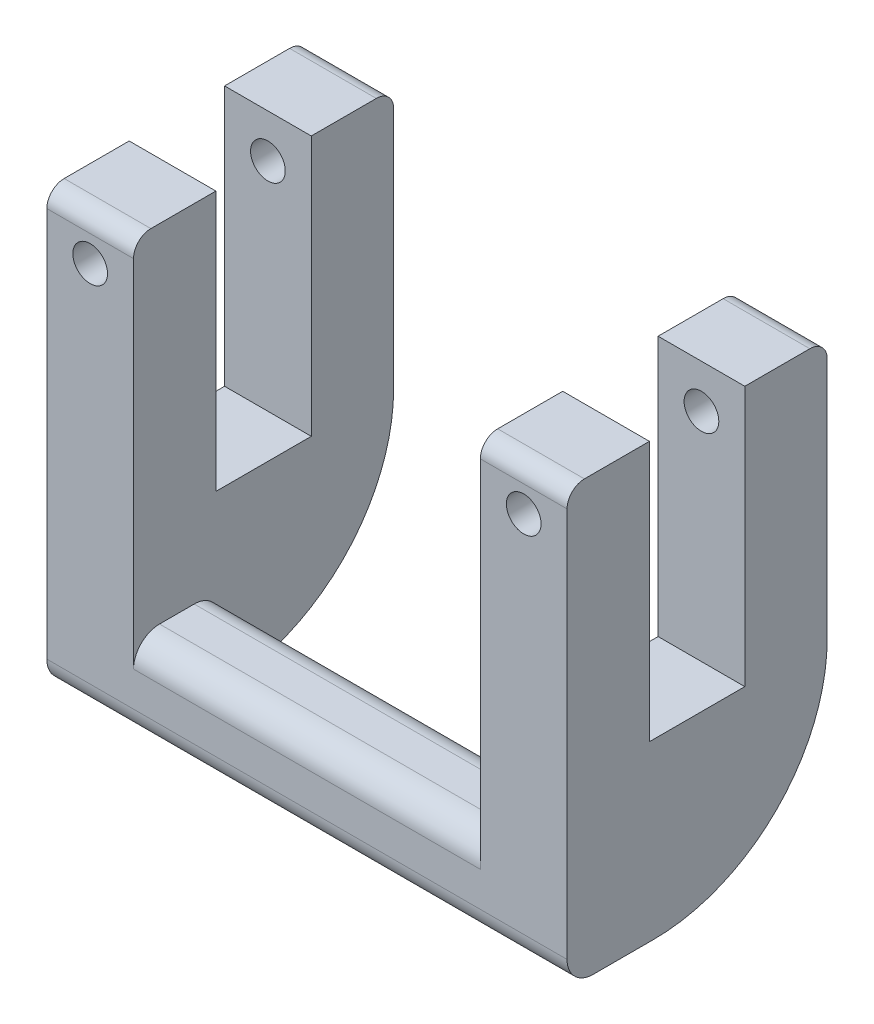
ISO-10303-21;
HEADER;
FILE_DESCRIPTION(('STEP AP214'),'2;1');
FILE_NAME('part.step','',(''),(''),'','','');
FILE_SCHEMA(('AUTOMOTIVE_DESIGN { 1 0 10303 214 1 1 1 1 }'));
ENDSEC;
DATA;
#1=APPLICATION_CONTEXT('core data for automotive mechanical design processes');
#2=APPLICATION_PROTOCOL_DEFINITION('international standard','automotive_design',2000,#1);
#3=PRODUCT_CONTEXT('',#1,'mechanical');
#4=PRODUCT('Part','Part','',(#3));
#5=PRODUCT_RELATED_PRODUCT_CATEGORY('part','',(#4));
#6=PRODUCT_DEFINITION_FORMATION('','',#4);
#7=PRODUCT_DEFINITION_CONTEXT('part definition',#1,'design');
#8=PRODUCT_DEFINITION('design','',#6,#7);
#9=PRODUCT_DEFINITION_SHAPE('','',#8);
#10=(LENGTH_UNIT() NAMED_UNIT(*) SI_UNIT(.MILLI.,.METRE.));
#11=(NAMED_UNIT(*) PLANE_ANGLE_UNIT() SI_UNIT($,.RADIAN.));
#12=(NAMED_UNIT(*) SI_UNIT($,.STERADIAN.) SOLID_ANGLE_UNIT());
#13=UNCERTAINTY_MEASURE_WITH_UNIT(LENGTH_MEASURE(1.E-05),#10,'distance_accuracy_value','');
#14=(GEOMETRIC_REPRESENTATION_CONTEXT(3) GLOBAL_UNCERTAINTY_ASSIGNED_CONTEXT((#13)) GLOBAL_UNIT_ASSIGNED_CONTEXT((#10,
#11,#12)) REPRESENTATION_CONTEXT('',''));
#15=CARTESIAN_POINT('',(0.,0.,0.));
#16=DIRECTION('',(0.,0.,1.));
#17=DIRECTION('',(1.,0.,0.));
#18=AXIS2_PLACEMENT_3D('',#15,#16,#17);
#19=CARTESIAN_POINT('',(0.,0.,30.));
#20=DIRECTION('',(0.,-1.,0.));
#21=DIRECTION('',(0.,0.,-1.));
#22=AXIS2_PLACEMENT_3D('',#19,#20,#21);
#23=PLANE('',#22);
#24=DIRECTION('',(0.,0.,-1.));
#25=VECTOR('',#24,1.);
#26=CARTESIAN_POINT('',(-40.,0.,30.));
#27=LINE('',#26,#25);
#28=CARTESIAN_POINT('',(-40.,0.,27.));
#29=VERTEX_POINT('',#28);
#30=CARTESIAN_POINT('',(-40.,0.,23.));
#31=VERTEX_POINT('',#30);
#32=EDGE_CURVE('E355',#29,#31,#27,.T.);
#33=ORIENTED_EDGE('',*,*,#32,.F.);
#34=DIRECTION('',(-1.,0.,0.));
#35=VECTOR('',#34,1.);
#36=CARTESIAN_POINT('',(0.,0.,27.));
#37=LINE('',#36,#35);
#38=CARTESIAN_POINT('',(0.,0.,27.));
#39=VERTEX_POINT('',#38);
#40=EDGE_CURVE('E400',#29,#39,#37,.F.);
#41=ORIENTED_EDGE('',*,*,#40,.T.);
#42=DIRECTION('',(0.,0.,-1.));
#43=VECTOR('',#42,1.);
#44=CARTESIAN_POINT('',(0.,0.,30.));
#45=LINE('',#44,#43);
#46=CARTESIAN_POINT('',(0.,0.,23.));
#47=VERTEX_POINT('',#46);
#48=EDGE_CURVE('E359',#39,#47,#45,.T.);
#49=ORIENTED_EDGE('',*,*,#48,.T.);
#50=DIRECTION('',(1.,0.,0.));
#51=VECTOR('',#50,1.);
#52=CARTESIAN_POINT('',(-40.,0.,23.));
#53=LINE('',#52,#51);
#54=EDGE_CURVE('E397',#47,#31,#53,.F.);
#55=ORIENTED_EDGE('',*,*,#54,.T.);
#56=EDGE_LOOP('',(#33,#41,#49,#55));
#57=FACE_BOUND('',#56,.T.);
#58=ADVANCED_FACE('F39',(#57),#23,.F.);
#59=CARTESIAN_POINT('',(0.,0.,0.));
#60=DIRECTION('',(0.,0.,-1.));
#61=DIRECTION('',(-1.,0.,0.));
#62=AXIS2_PLACEMENT_3D('',#59,#60,#61);
#63=PLANE('',#62);
#64=CARTESIAN_POINT('',(5.,35.,0.));
#65=DIRECTION('',(0.,0.,-1.));
#66=DIRECTION('',(-1.,0.,0.));
#67=AXIS2_PLACEMENT_3D('',#64,#65,#66);
#68=CIRCLE('',#67,2.);
#69=CARTESIAN_POINT('',(3.,35.,0.));
#70=VERTEX_POINT('',#69);
#71=EDGE_CURVE('E624',#70,#70,#68,.T.);
#72=ORIENTED_EDGE('',*,*,#71,.F.);
#73=EDGE_LOOP('',(#72));
#74=FACE_BOUND('',#73,.T.);
#75=DIRECTION('',(0.,-1.,0.));
#76=VECTOR('',#75,1.);
#77=CARTESIAN_POINT('',(0.,40.,0.));
#78=LINE('',#77,#76);
#79=CARTESIAN_POINT('',(0.,38.,0.));
#80=VERTEX_POINT('',#79);
#81=CARTESIAN_POINT('',(0.,9.99999999999999,0.));
#82=VERTEX_POINT('',#81);
#83=EDGE_CURVE('E305',#80,#82,#78,.T.);
#84=ORIENTED_EDGE('',*,*,#83,.F.);
#85=DIRECTION('',(-1.,0.,0.));
#86=VECTOR('',#85,1.);
#87=CARTESIAN_POINT('',(10.,38.,0.));
#88=LINE('',#87,#86);
#89=CARTESIAN_POINT('',(10.,38.,0.));
#90=VERTEX_POINT('',#89);
#91=EDGE_CURVE('E11',#80,#90,#88,.F.);
#92=ORIENTED_EDGE('',*,*,#91,.T.);
#93=DIRECTION('',(0.,1.,0.));
#94=VECTOR('',#93,1.);
#95=CARTESIAN_POINT('',(10.,-10.,0.));
#96=LINE('',#95,#94);
#97=CARTESIAN_POINT('',(10.,9.99999999999999,0.));
#98=VERTEX_POINT('',#97);
#99=EDGE_CURVE('E310',#98,#90,#96,.T.);
#100=ORIENTED_EDGE('',*,*,#99,.F.);
#101=DIRECTION('',(1.,0.,0.));
#102=VECTOR('',#101,1.);
#103=CARTESIAN_POINT('',(0.,9.99999999999999,0.));
#104=LINE('',#103,#102);
#105=EDGE_CURVE('E452',#98,#82,#104,.F.);
#106=ORIENTED_EDGE('',*,*,#105,.T.);
#107=EDGE_LOOP('',(#84,#92,#100,#106));
#108=FACE_BOUND('',#107,.T.);
#109=ADVANCED_FACE('F607',(#74,#108),#63,.T.);
#110=CARTESIAN_POINT('',(-40.,40.,30.));
#111=DIRECTION('',(0.,-1.,0.));
#112=DIRECTION('',(1.,0.,0.));
#113=AXIS2_PLACEMENT_3D('',#110,#111,#112);
#114=PLANE('',#113);
#115=DIRECTION('',(0.,0.,-1.));
#116=VECTOR('',#115,1.);
#117=CARTESIAN_POINT('',(-50.,40.,30.));
#118=LINE('',#117,#116);
#119=CARTESIAN_POINT('',(-50.,40.,28.));
#120=VERTEX_POINT('',#119);
#121=CARTESIAN_POINT('',(-50.,40.,20.5));
#122=VERTEX_POINT('',#121);
#123=EDGE_CURVE('E255',#120,#122,#118,.T.);
#124=ORIENTED_EDGE('',*,*,#123,.F.);
#125=DIRECTION('',(-1.,0.,0.));
#126=VECTOR('',#125,1.);
#127=CARTESIAN_POINT('',(-40.,40.,28.));
#128=LINE('',#127,#126);
#129=CARTESIAN_POINT('',(-40.,40.,28.));
#130=VERTEX_POINT('',#129);
#131=EDGE_CURVE('E498',#120,#130,#128,.F.);
#132=ORIENTED_EDGE('',*,*,#131,.T.);
#133=DIRECTION('',(0.,0.,-1.));
#134=VECTOR('',#133,1.);
#135=CARTESIAN_POINT('',(-40.,40.,30.));
#136=LINE('',#135,#134);
#137=CARTESIAN_POINT('',(-40.,40.,20.5));
#138=VERTEX_POINT('',#137);
#139=EDGE_CURVE('E352',#130,#138,#136,.T.);
#140=ORIENTED_EDGE('',*,*,#139,.T.);
#141=DIRECTION('',(-1.,0.,0.));
#142=VECTOR('',#141,1.);
#143=CARTESIAN_POINT('',(-40.,40.,20.5));
#144=LINE('',#143,#142);
#145=EDGE_CURVE('E293',#138,#122,#144,.T.);
#146=ORIENTED_EDGE('',*,*,#145,.T.);
#147=EDGE_LOOP('',(#124,#132,#140,#146));
#148=FACE_BOUND('',#147,.T.);
#149=ADVANCED_FACE('F569',(#148),#114,.F.);
#150=CARTESIAN_POINT('',(10.,40.,30.));
#151=DIRECTION('',(0.,-1.,0.));
#152=DIRECTION('',(0.,0.,-1.));
#153=AXIS2_PLACEMENT_3D('',#150,#151,#152);
#154=PLANE('',#153);
#155=DIRECTION('',(0.,0.,-1.));
#156=VECTOR('',#155,1.);
#157=CARTESIAN_POINT('',(0.,40.,30.));
#158=LINE('',#157,#156);
#159=CARTESIAN_POINT('',(0.,40.,28.));
#160=VERTEX_POINT('',#159);
#161=CARTESIAN_POINT('',(0.,40.,20.5));
#162=VERTEX_POINT('',#161);
#163=EDGE_CURVE('E333',#160,#162,#158,.T.);
#164=ORIENTED_EDGE('',*,*,#163,.F.);
#165=DIRECTION('',(-1.,0.,0.));
#166=VECTOR('',#165,1.);
#167=CARTESIAN_POINT('',(10.,40.,28.));
#168=LINE('',#167,#166);
#169=CARTESIAN_POINT('',(10.,40.,28.));
#170=VERTEX_POINT('',#169);
#171=EDGE_CURVE('E507',#160,#170,#168,.F.);
#172=ORIENTED_EDGE('',*,*,#171,.T.);
#173=DIRECTION('',(0.,0.,-1.));
#174=VECTOR('',#173,1.);
#175=CARTESIAN_POINT('',(10.,40.,30.));
#176=LINE('',#175,#174);
#177=CARTESIAN_POINT('',(10.,40.,20.5));
#178=VERTEX_POINT('',#177);
#179=EDGE_CURVE('E337',#170,#178,#176,.T.);
#180=ORIENTED_EDGE('',*,*,#179,.T.);
#181=DIRECTION('',(-1.,0.,0.));
#182=VECTOR('',#181,1.);
#183=CARTESIAN_POINT('',(10.,40.,20.5));
#184=LINE('',#183,#182);
#185=EDGE_CURVE('E367',#178,#162,#184,.T.);
#186=ORIENTED_EDGE('',*,*,#185,.T.);
#187=EDGE_LOOP('',(#164,#172,#180,#186));
#188=FACE_BOUND('',#187,.T.);
#189=ADVANCED_FACE('F545',(#188),#154,.F.);
#190=CARTESIAN_POINT('',(0.,40.,30.));
#191=DIRECTION('',(1.,0.,0.));
#192=DIRECTION('',(0.,1.,0.));
#193=AXIS2_PLACEMENT_3D('',#190,#191,#192);
#194=PLANE('',#193);
#195=DIRECTION('',(0.,-1.,0.));
#196=VECTOR('',#195,1.);
#197=CARTESIAN_POINT('',(0.,40.,30.));
#198=LINE('',#197,#196);
#199=CARTESIAN_POINT('',(0.,38.,30.));
#200=VERTEX_POINT('',#199);
#201=CARTESIAN_POINT('',(0.,-3.,30.));
#202=VERTEX_POINT('',#201);
#203=EDGE_CURVE('E306',#200,#202,#198,.T.);
#204=ORIENTED_EDGE('',*,*,#203,.F.);
#205=CARTESIAN_POINT('',(0.,38.,28.));
#206=DIRECTION('',(1.,0.,0.));
#207=DIRECTION('',(0.,1.,0.));
#208=AXIS2_PLACEMENT_3D('',#205,#206,#207);
#209=CIRCLE('',#208,2.);
#210=EDGE_CURVE('E504',#200,#160,#209,.F.);
#211=ORIENTED_EDGE('',*,*,#210,.T.);
#212=ORIENTED_EDGE('',*,*,#163,.T.);
#213=DIRECTION('',(0.,-1.,0.));
#214=VECTOR('',#213,1.);
#215=CARTESIAN_POINT('',(0.,40.,20.5));
#216=LINE('',#215,#214);
#217=CARTESIAN_POINT('',(0.,10.,20.5));
#218=VERTEX_POINT('',#217);
#219=EDGE_CURVE('E289',#162,#218,#216,.T.);
#220=ORIENTED_EDGE('',*,*,#219,.T.);
#221=DIRECTION('',(0.,0.,-1.));
#222=VECTOR('',#221,1.);
#223=CARTESIAN_POINT('',(0.,9.99999999999999,30.));
#224=LINE('',#223,#222);
#225=CARTESIAN_POINT('',(0.,10.,9.49999999999999));
#226=VERTEX_POINT('',#225);
#227=EDGE_CURVE('E301',#218,#226,#224,.T.);
#228=ORIENTED_EDGE('',*,*,#227,.T.);
#229=DIRECTION('',(0.,1.,0.));
#230=VECTOR('',#229,1.);
#231=CARTESIAN_POINT('',(0.,40.,9.5));
#232=LINE('',#231,#230);
#233=CARTESIAN_POINT('',(0.,40.,9.5));
#234=VERTEX_POINT('',#233);
#235=EDGE_CURVE('E273',#226,#234,#232,.T.);
#236=ORIENTED_EDGE('',*,*,#235,.T.);
#237=CARTESIAN_POINT('',(0.,40.,2.));
#238=VERTEX_POINT('',#237);
#239=EDGE_CURVE('E321',#234,#238,#158,.T.);
#240=ORIENTED_EDGE('',*,*,#239,.T.);
#241=CARTESIAN_POINT('',(0.,38.,2.));
#242=DIRECTION('',(1.,0.,0.));
#243=DIRECTION('',(0.,1.,0.));
#244=AXIS2_PLACEMENT_3D('',#241,#242,#243);
#245=CIRCLE('',#244,2.);
#246=EDGE_CURVE('E501',#238,#80,#245,.F.);
#247=ORIENTED_EDGE('',*,*,#246,.T.);
#248=ORIENTED_EDGE('',*,*,#83,.T.);
#249=CARTESIAN_POINT('',(0.,9.99999999999999,20.));
#250=DIRECTION('',(1.,0.,0.));
#251=DIRECTION('',(0.,1.,0.));
#252=AXIS2_PLACEMENT_3D('',#249,#250,#251);
#253=CIRCLE('',#252,20.);
#254=CARTESIAN_POINT('',(0.,-10.,20.));
#255=VERTEX_POINT('',#254);
#256=EDGE_CURVE('E456',#82,#255,#253,.F.);
#257=ORIENTED_EDGE('',*,*,#256,.T.);
#258=DIRECTION('',(0.,0.,-1.));
#259=VECTOR('',#258,1.);
#260=CARTESIAN_POINT('',(0.,-10.,20.));
#261=LINE('',#260,#259);
#262=CARTESIAN_POINT('',(0.,-10.,23.));
#263=VERTEX_POINT('',#262);
#264=EDGE_CURVE('E261',#263,#255,#261,.T.);
#265=ORIENTED_EDGE('',*,*,#264,.F.);
#266=CARTESIAN_POINT('',(0.,-7.,23.));
#267=DIRECTION('',(1.,0.,0.));
#268=DIRECTION('',(0.,1.,0.));
#269=AXIS2_PLACEMENT_3D('',#266,#267,#268);
#270=CIRCLE('',#269,3.);
#271=CARTESIAN_POINT('',(0.,-7.,20.));
#272=VERTEX_POINT('',#271);
#273=EDGE_CURVE('E422',#263,#272,#270,.T.);
#274=ORIENTED_EDGE('',*,*,#273,.T.);
#275=DIRECTION('',(0.,-1.,0.));
#276=VECTOR('',#275,1.);
#277=CARTESIAN_POINT('',(0.,0.,20.));
#278=LINE('',#277,#276);
#279=CARTESIAN_POINT('',(0.,-3.,20.));
#280=VERTEX_POINT('',#279);
#281=EDGE_CURVE('E617',#280,#272,#278,.T.);
#282=ORIENTED_EDGE('',*,*,#281,.F.);
#283=CARTESIAN_POINT('',(0.,-3.,23.));
#284=DIRECTION('',(1.,0.,0.));
#285=DIRECTION('',(0.,1.,0.));
#286=AXIS2_PLACEMENT_3D('',#283,#284,#285);
#287=CIRCLE('',#286,3.);
#288=EDGE_CURVE('E425',#280,#47,#287,.T.);
#289=ORIENTED_EDGE('',*,*,#288,.T.);
#290=ORIENTED_EDGE('',*,*,#48,.F.);
#291=CARTESIAN_POINT('',(0.,-3.,27.));
#292=DIRECTION('',(1.,0.,0.));
#293=DIRECTION('',(0.,1.,0.));
#294=AXIS2_PLACEMENT_3D('',#291,#292,#293);
#295=CIRCLE('',#294,3.);
#296=EDGE_CURVE('E414',#39,#202,#295,.T.);
#297=ORIENTED_EDGE('',*,*,#296,.T.);
#298=EDGE_LOOP('',(#204,#211,#212,#220,#228,#236,#240,#247,#248,#257,#265,#274,#282,#289,#290,#297));
#299=FACE_BOUND('',#298,.T.);
#300=ADVANCED_FACE('F524',(#299),#194,.F.);
#301=CARTESIAN_POINT('',(-40.,0.,30.));
#302=DIRECTION('',(-1.,0.,0.));
#303=DIRECTION('',(0.,0.,1.));
#304=AXIS2_PLACEMENT_3D('',#301,#302,#303);
#305=PLANE('',#304);
#306=DIRECTION('',(0.,1.,0.));
#307=VECTOR('',#306,1.);
#308=CARTESIAN_POINT('',(-40.,0.,0.));
#309=LINE('',#308,#307);
#310=CARTESIAN_POINT('',(-40.,9.99999999999999,0.));
#311=VERTEX_POINT('',#310);
#312=CARTESIAN_POINT('',(-40.,38.,0.));
#313=VERTEX_POINT('',#312);
#314=EDGE_CURVE('E324',#311,#313,#309,.T.);
#315=ORIENTED_EDGE('',*,*,#314,.T.);
#316=CARTESIAN_POINT('',(-40.,38.,2.));
#317=DIRECTION('',(-1.,0.,0.));
#318=DIRECTION('',(0.,0.,1.));
#319=AXIS2_PLACEMENT_3D('',#316,#317,#318);
#320=CIRCLE('',#319,2.);
#321=CARTESIAN_POINT('',(-40.,40.,2.));
#322=VERTEX_POINT('',#321);
#323=EDGE_CURVE('E487',#313,#322,#320,.F.);
#324=ORIENTED_EDGE('',*,*,#323,.T.);
#325=CARTESIAN_POINT('',(-40.,40.,9.5));
#326=VERTEX_POINT('',#325);
#327=EDGE_CURVE('E351',#326,#322,#136,.T.);
#328=ORIENTED_EDGE('',*,*,#327,.F.);
#329=DIRECTION('',(0.,-1.,0.));
#330=VECTOR('',#329,1.);
#331=CARTESIAN_POINT('',(-40.,0.,9.49999999999999));
#332=LINE('',#331,#330);
#333=CARTESIAN_POINT('',(-40.,10.,9.49999999999999));
#334=VERTEX_POINT('',#333);
#335=EDGE_CURVE('E281',#326,#334,#332,.T.);
#336=ORIENTED_EDGE('',*,*,#335,.T.);
#337=DIRECTION('',(0.,0.,1.));
#338=VECTOR('',#337,1.);
#339=CARTESIAN_POINT('',(-40.,9.99999999999999,30.));
#340=LINE('',#339,#338);
#341=CARTESIAN_POINT('',(-40.,9.99999999999999,20.5));
#342=VERTEX_POINT('',#341);
#343=EDGE_CURVE('E298',#334,#342,#340,.T.);
#344=ORIENTED_EDGE('',*,*,#343,.T.);
#345=DIRECTION('',(0.,1.,0.));
#346=VECTOR('',#345,1.);
#347=CARTESIAN_POINT('',(-40.,0.,20.5));
#348=LINE('',#347,#346);
#349=EDGE_CURVE('E234',#342,#138,#348,.T.);
#350=ORIENTED_EDGE('',*,*,#349,.T.);
#351=ORIENTED_EDGE('',*,*,#139,.F.);
#352=CARTESIAN_POINT('',(-40.,38.,28.));
#353=DIRECTION('',(-1.,0.,0.));
#354=DIRECTION('',(0.,0.,1.));
#355=AXIS2_PLACEMENT_3D('',#352,#353,#354);
#356=CIRCLE('',#355,2.);
#357=CARTESIAN_POINT('',(-40.,38.,30.));
#358=VERTEX_POINT('',#357);
#359=EDGE_CURVE('E484',#130,#358,#356,.F.);
#360=ORIENTED_EDGE('',*,*,#359,.T.);
#361=DIRECTION('',(0.,1.,0.));
#362=VECTOR('',#361,1.);
#363=CARTESIAN_POINT('',(-40.,0.,30.));
#364=LINE('',#363,#362);
#365=CARTESIAN_POINT('',(-40.,-3.,30.));
#366=VERTEX_POINT('',#365);
#367=EDGE_CURVE('E309',#366,#358,#364,.T.);
#368=ORIENTED_EDGE('',*,*,#367,.F.);
#369=CARTESIAN_POINT('',(-40.,-3.,27.));
#370=DIRECTION('',(-1.,0.,0.));
#371=DIRECTION('',(0.,0.,1.));
#372=AXIS2_PLACEMENT_3D('',#369,#370,#371);
#373=CIRCLE('',#372,3.);
#374=EDGE_CURVE('E411',#366,#29,#373,.T.);
#375=ORIENTED_EDGE('',*,*,#374,.T.);
#376=ORIENTED_EDGE('',*,*,#32,.T.);
#377=CARTESIAN_POINT('',(-40.,-3.,23.));
#378=DIRECTION('',(-1.,0.,0.));
#379=DIRECTION('',(0.,0.,1.));
#380=AXIS2_PLACEMENT_3D('',#377,#378,#379);
#381=CIRCLE('',#380,3.);
#382=CARTESIAN_POINT('',(-40.,-3.,20.));
#383=VERTEX_POINT('',#382);
#384=EDGE_CURVE('E428',#31,#383,#381,.T.);
#385=ORIENTED_EDGE('',*,*,#384,.T.);
#386=DIRECTION('',(0.,1.,0.));
#387=VECTOR('',#386,1.);
#388=CARTESIAN_POINT('',(-40.,0.,20.));
#389=LINE('',#388,#387);
#390=CARTESIAN_POINT('',(-40.,-7.,20.));
#391=VERTEX_POINT('',#390);
#392=EDGE_CURVE('E614',#391,#383,#389,.T.);
#393=ORIENTED_EDGE('',*,*,#392,.F.);
#394=CARTESIAN_POINT('',(-40.,-7.,23.));
#395=DIRECTION('',(-1.,0.,0.));
#396=DIRECTION('',(0.,0.,1.));
#397=AXIS2_PLACEMENT_3D('',#394,#395,#396);
#398=CIRCLE('',#397,3.);
#399=CARTESIAN_POINT('',(-40.,-10.,23.));
#400=VERTEX_POINT('',#399);
#401=EDGE_CURVE('E418',#391,#400,#398,.T.);
#402=ORIENTED_EDGE('',*,*,#401,.T.);
#403=DIRECTION('',(0.,0.,-1.));
#404=VECTOR('',#403,1.);
#405=CARTESIAN_POINT('',(-40.,-10.,20.));
#406=LINE('',#405,#404);
#407=CARTESIAN_POINT('',(-40.,-10.,20.));
#408=VERTEX_POINT('',#407);
#409=EDGE_CURVE('E257',#400,#408,#406,.T.);
#410=ORIENTED_EDGE('',*,*,#409,.T.);
#411=CARTESIAN_POINT('',(-40.,9.99999999999999,20.));
#412=DIRECTION('',(-1.,0.,0.));
#413=DIRECTION('',(0.,0.,1.));
#414=AXIS2_PLACEMENT_3D('',#411,#412,#413);
#415=CIRCLE('',#414,20.);
#416=EDGE_CURVE('E439',#408,#311,#415,.F.);
#417=ORIENTED_EDGE('',*,*,#416,.T.);
#418=EDGE_LOOP('',(#315,#324,#328,#336,#344,#350,#351,#360,#368,#375,#376,#385,#393,#402,#410,#417));
#419=FACE_BOUND('',#418,.T.);
#420=ADVANCED_FACE('F571',(#419),#305,.F.);
#421=ORIENTED_EDGE('',*,*,#327,.T.);
#422=DIRECTION('',(-1.,0.,0.));
#423=VECTOR('',#422,1.);
#424=CARTESIAN_POINT('',(-50.,40.,2.));
#425=LINE('',#424,#423);
#426=CARTESIAN_POINT('',(-50.,40.,2.));
#427=VERTEX_POINT('',#426);
#428=EDGE_CURVE('E459',#322,#427,#425,.T.);
#429=ORIENTED_EDGE('',*,*,#428,.T.);
#430=CARTESIAN_POINT('',(-50.,40.,9.5));
#431=VERTEX_POINT('',#430);
#432=EDGE_CURVE('E348',#431,#427,#118,.T.);
#433=ORIENTED_EDGE('',*,*,#432,.F.);
#434=DIRECTION('',(1.,0.,0.));
#435=VECTOR('',#434,1.);
#436=CARTESIAN_POINT('',(-40.,40.,9.5));
#437=LINE('',#436,#435);
#438=EDGE_CURVE('E277',#431,#326,#437,.T.);
#439=ORIENTED_EDGE('',*,*,#438,.T.);
#440=EDGE_LOOP('',(#421,#429,#433,#439));
#441=FACE_BOUND('',#440,.T.);
#442=ADVANCED_FACE('F578',(#441),#114,.F.);
#443=CARTESIAN_POINT('',(-50.,40.,30.));
#444=DIRECTION('',(1.,0.,0.));
#445=DIRECTION('',(0.,1.,0.));
#446=AXIS2_PLACEMENT_3D('',#443,#444,#445);
#447=PLANE('',#446);
#448=ORIENTED_EDGE('',*,*,#432,.T.);
#449=CARTESIAN_POINT('',(-50.,38.,2.));
#450=DIRECTION('',(1.,0.,0.));
#451=DIRECTION('',(0.,1.,0.));
#452=AXIS2_PLACEMENT_3D('',#449,#450,#451);
#453=CIRCLE('',#452,2.);
#454=CARTESIAN_POINT('',(-50.,38.,0.));
#455=VERTEX_POINT('',#454);
#456=EDGE_CURVE('E478',#427,#455,#453,.F.);
#457=ORIENTED_EDGE('',*,*,#456,.T.);
#458=DIRECTION('',(0.,-1.,0.));
#459=VECTOR('',#458,1.);
#460=CARTESIAN_POINT('',(-50.,40.,0.));
#461=LINE('',#460,#459);
#462=CARTESIAN_POINT('',(-50.,9.99999999999999,0.));
#463=VERTEX_POINT('',#462);
#464=EDGE_CURVE('E328',#455,#463,#461,.T.);
#465=ORIENTED_EDGE('',*,*,#464,.T.);
#466=CARTESIAN_POINT('',(-50.,9.99999999999999,20.));
#467=DIRECTION('',(1.,0.,0.));
#468=DIRECTION('',(0.,1.,0.));
#469=AXIS2_PLACEMENT_3D('',#466,#467,#468);
#470=CIRCLE('',#469,20.);
#471=CARTESIAN_POINT('',(-50.,-10.,20.));
#472=VERTEX_POINT('',#471);
#473=EDGE_CURVE('E446',#463,#472,#470,.F.);
#474=ORIENTED_EDGE('',*,*,#473,.T.);
#475=DIRECTION('',(0.,0.,-1.));
#476=VECTOR('',#475,1.);
#477=CARTESIAN_POINT('',(-50.,-10.,30.));
#478=LINE('',#477,#476);
#479=CARTESIAN_POINT('',(-50.,-10.,27.));
#480=VERTEX_POINT('',#479);
#481=EDGE_CURVE('E344',#480,#472,#478,.T.);
#482=ORIENTED_EDGE('',*,*,#481,.F.);
#483=CARTESIAN_POINT('',(-50.,-7.,27.));
#484=DIRECTION('',(1.,0.,0.));
#485=DIRECTION('',(0.,1.,0.));
#486=AXIS2_PLACEMENT_3D('',#483,#484,#485);
#487=CIRCLE('',#486,3.);
#488=CARTESIAN_POINT('',(-50.,-7.,30.));
#489=VERTEX_POINT('',#488);
#490=EDGE_CURVE('E393',#480,#489,#487,.F.);
#491=ORIENTED_EDGE('',*,*,#490,.T.);
#492=DIRECTION('',(0.,-1.,0.));
#493=VECTOR('',#492,1.);
#494=CARTESIAN_POINT('',(-50.,40.,30.));
#495=LINE('',#494,#493);
#496=CARTESIAN_POINT('',(-50.,38.,30.));
#497=VERTEX_POINT('',#496);
#498=EDGE_CURVE('E314',#497,#489,#495,.T.);
#499=ORIENTED_EDGE('',*,*,#498,.F.);
#500=CARTESIAN_POINT('',(-50.,38.,28.));
#501=DIRECTION('',(1.,0.,0.));
#502=DIRECTION('',(0.,1.,0.));
#503=AXIS2_PLACEMENT_3D('',#500,#501,#502);
#504=CIRCLE('',#503,2.);
#505=EDGE_CURVE('E475',#497,#120,#504,.F.);
#506=ORIENTED_EDGE('',*,*,#505,.T.);
#507=ORIENTED_EDGE('',*,*,#123,.T.);
#508=DIRECTION('',(0.,-1.,0.));
#509=VECTOR('',#508,1.);
#510=CARTESIAN_POINT('',(-50.,70.,20.5));
#511=LINE('',#510,#509);
#512=CARTESIAN_POINT('',(-50.,9.99999999999999,20.5));
#513=VERTEX_POINT('',#512);
#514=EDGE_CURVE('E231',#122,#513,#511,.T.);
#515=ORIENTED_EDGE('',*,*,#514,.T.);
#516=DIRECTION('',(0.,0.,-1.));
#517=VECTOR('',#516,1.);
#518=CARTESIAN_POINT('',(-50.,10.,9.49999999999999));
#519=LINE('',#518,#517);
#520=CARTESIAN_POINT('',(-50.,9.99999999999999,9.49999999999999));
#521=VERTEX_POINT('',#520);
#522=EDGE_CURVE('E243',#513,#521,#519,.T.);
#523=ORIENTED_EDGE('',*,*,#522,.T.);
#524=DIRECTION('',(0.,1.,0.));
#525=VECTOR('',#524,1.);
#526=CARTESIAN_POINT('',(-50.,70.,9.5));
#527=LINE('',#526,#525);
#528=EDGE_CURVE('E250',#521,#431,#527,.T.);
#529=ORIENTED_EDGE('',*,*,#528,.T.);
#530=EDGE_LOOP('',(#448,#457,#465,#474,#482,#491,#499,#506,#507,#515,#523,#529));
#531=FACE_BOUND('',#530,.T.);
#532=ADVANCED_FACE('F253',(#531),#447,.F.);
#533=CARTESIAN_POINT('',(-50.,-10.,30.));
#534=DIRECTION('',(0.,1.,0.));
#535=DIRECTION('',(0.,0.,1.));
#536=AXIS2_PLACEMENT_3D('',#533,#534,#535);
#537=PLANE('',#536);
#538=ORIENTED_EDGE('',*,*,#481,.T.);
#539=DIRECTION('',(1.,0.,0.));
#540=VECTOR('',#539,1.);
#541=CARTESIAN_POINT('',(-40.,-10.,20.));
#542=LINE('',#541,#540);
#543=EDGE_CURVE('E435',#472,#408,#542,.T.);
#544=ORIENTED_EDGE('',*,*,#543,.T.);
#545=ORIENTED_EDGE('',*,*,#409,.F.);
#546=DIRECTION('',(-1.,0.,0.));
#547=VECTOR('',#546,1.);
#548=CARTESIAN_POINT('',(0.,-10.,23.));
#549=LINE('',#548,#547);
#550=EDGE_CURVE('E386',#400,#263,#549,.F.);
#551=ORIENTED_EDGE('',*,*,#550,.T.);
#552=ORIENTED_EDGE('',*,*,#264,.T.);
#553=DIRECTION('',(1.,0.,0.));
#554=VECTOR('',#553,1.);
#555=CARTESIAN_POINT('',(10.,-10.,20.));
#556=LINE('',#555,#554);
#557=CARTESIAN_POINT('',(10.,-10.,20.));
#558=VERTEX_POINT('',#557);
#559=EDGE_CURVE('E431',#255,#558,#556,.T.);
#560=ORIENTED_EDGE('',*,*,#559,.T.);
#561=DIRECTION('',(0.,0.,-1.));
#562=VECTOR('',#561,1.);
#563=CARTESIAN_POINT('',(10.,-10.,30.));
#564=LINE('',#563,#562);
#565=CARTESIAN_POINT('',(10.,-10.,27.));
#566=VERTEX_POINT('',#565);
#567=EDGE_CURVE('E340',#566,#558,#564,.T.);
#568=ORIENTED_EDGE('',*,*,#567,.F.);
#569=DIRECTION('',(1.,0.,0.));
#570=VECTOR('',#569,1.);
#571=CARTESIAN_POINT('',(-50.,-10.,27.));
#572=LINE('',#571,#570);
#573=EDGE_CURVE('E390',#566,#480,#572,.F.);
#574=ORIENTED_EDGE('',*,*,#573,.T.);
#575=EDGE_LOOP('',(#538,#544,#545,#551,#552,#560,#568,#574));
#576=FACE_BOUND('',#575,.T.);
#577=ADVANCED_FACE('F598',(#576),#537,.F.);
#578=CARTESIAN_POINT('',(10.,-10.,30.));
#579=DIRECTION('',(-1.,0.,0.));
#580=DIRECTION('',(0.,-1.,0.));
#581=AXIS2_PLACEMENT_3D('',#578,#579,#580);
#582=PLANE('',#581);
#583=ORIENTED_EDGE('',*,*,#179,.F.);
#584=CARTESIAN_POINT('',(10.,38.,28.));
#585=DIRECTION('',(-1.,0.,0.));
#586=DIRECTION('',(0.,-1.,0.));
#587=AXIS2_PLACEMENT_3D('',#584,#585,#586);
#588=CIRCLE('',#587,2.);
#589=CARTESIAN_POINT('',(10.,38.,30.));
#590=VERTEX_POINT('',#589);
#591=EDGE_CURVE('E512',#170,#590,#588,.F.);
#592=ORIENTED_EDGE('',*,*,#591,.T.);
#593=DIRECTION('',(0.,1.,0.));
#594=VECTOR('',#593,1.);
#595=CARTESIAN_POINT('',(10.,-10.,30.));
#596=LINE('',#595,#594);
#597=CARTESIAN_POINT('',(10.,-7.,30.));
#598=VERTEX_POINT('',#597);
#599=EDGE_CURVE('E317',#598,#590,#596,.T.);
#600=ORIENTED_EDGE('',*,*,#599,.F.);
#601=CARTESIAN_POINT('',(10.,-7.,27.));
#602=DIRECTION('',(-1.,0.,0.));
#603=DIRECTION('',(0.,-1.,0.));
#604=AXIS2_PLACEMENT_3D('',#601,#602,#603);
#605=CIRCLE('',#604,3.);
#606=EDGE_CURVE('E383',#598,#566,#605,.F.);
#607=ORIENTED_EDGE('',*,*,#606,.T.);
#608=ORIENTED_EDGE('',*,*,#567,.T.);
#609=CARTESIAN_POINT('',(10.,9.99999999999999,20.));
#610=DIRECTION('',(-1.,0.,0.));
#611=DIRECTION('',(0.,-1.,0.));
#612=AXIS2_PLACEMENT_3D('',#609,#610,#611);
#613=CIRCLE('',#612,20.);
#614=EDGE_CURVE('E449',#558,#98,#613,.F.);
#615=ORIENTED_EDGE('',*,*,#614,.T.);
#616=ORIENTED_EDGE('',*,*,#99,.T.);
#617=CARTESIAN_POINT('',(10.,38.,2.));
#618=DIRECTION('',(-1.,0.,0.));
#619=DIRECTION('',(0.,-1.,0.));
#620=AXIS2_PLACEMENT_3D('',#617,#618,#619);
#621=CIRCLE('',#620,2.);
#622=CARTESIAN_POINT('',(10.,40.,2.));
#623=VERTEX_POINT('',#622);
#624=EDGE_CURVE('E55',#90,#623,#621,.F.);
#625=ORIENTED_EDGE('',*,*,#624,.T.);
#626=CARTESIAN_POINT('',(10.,40.,9.5));
#627=VERTEX_POINT('',#626);
#628=EDGE_CURVE('E336',#627,#623,#176,.T.);
#629=ORIENTED_EDGE('',*,*,#628,.F.);
#630=DIRECTION('',(0.,-1.,0.));
#631=VECTOR('',#630,1.);
#632=CARTESIAN_POINT('',(10.,-10.,9.49999999999999));
#633=LINE('',#632,#631);
#634=CARTESIAN_POINT('',(10.,10.,9.49999999999999));
#635=VERTEX_POINT('',#634);
#636=EDGE_CURVE('E268',#627,#635,#633,.T.);
#637=ORIENTED_EDGE('',*,*,#636,.T.);
#638=DIRECTION('',(0.,0.,1.));
#639=VECTOR('',#638,1.);
#640=CARTESIAN_POINT('',(10.,9.99999999999999,30.));
#641=LINE('',#640,#639);
#642=CARTESIAN_POINT('',(10.,10.,20.5));
#643=VERTEX_POINT('',#642);
#644=EDGE_CURVE('E371',#635,#643,#641,.T.);
#645=ORIENTED_EDGE('',*,*,#644,.T.);
#646=DIRECTION('',(0.,1.,0.));
#647=VECTOR('',#646,1.);
#648=CARTESIAN_POINT('',(10.,-10.,20.5));
#649=LINE('',#648,#647);
#650=EDGE_CURVE('E285',#643,#178,#649,.T.);
#651=ORIENTED_EDGE('',*,*,#650,.T.);
#652=EDGE_LOOP('',(#583,#592,#600,#607,#608,#615,#616,#625,#629,#637,#645,#651));
#653=FACE_BOUND('',#652,.T.);
#654=ADVANCED_FACE('F538',(#653),#582,.F.);
#655=ORIENTED_EDGE('',*,*,#628,.T.);
#656=DIRECTION('',(-1.,0.,0.));
#657=VECTOR('',#656,1.);
#658=CARTESIAN_POINT('',(0.,40.,2.));
#659=LINE('',#658,#657);
#660=EDGE_CURVE('E48',#623,#238,#659,.T.);
#661=ORIENTED_EDGE('',*,*,#660,.T.);
#662=ORIENTED_EDGE('',*,*,#239,.F.);
#663=DIRECTION('',(1.,0.,0.));
#664=VECTOR('',#663,1.);
#665=CARTESIAN_POINT('',(10.,40.,9.5));
#666=LINE('',#665,#664);
#667=EDGE_CURVE('E363',#234,#627,#666,.T.);
#668=ORIENTED_EDGE('',*,*,#667,.T.);
#669=EDGE_LOOP('',(#655,#661,#662,#668));
#670=FACE_BOUND('',#669,.T.);
#671=ADVANCED_FACE('F520',(#670),#154,.F.);
#672=CARTESIAN_POINT('',(0.,0.,30.));
#673=DIRECTION('',(0.,0.,-1.));
#674=DIRECTION('',(-1.,0.,0.));
#675=AXIS2_PLACEMENT_3D('',#672,#673,#674);
#676=PLANE('',#675);
#677=CARTESIAN_POINT('',(-45.,35.,30.));
#678=DIRECTION('',(0.,0.,-1.));
#679=DIRECTION('',(-1.,0.,0.));
#680=AXIS2_PLACEMENT_3D('',#677,#678,#679);
#681=CIRCLE('',#680,2.);
#682=CARTESIAN_POINT('',(-47.,35.,30.));
#683=VERTEX_POINT('',#682);
#684=EDGE_CURVE('E471',#683,#683,#681,.T.);
#685=ORIENTED_EDGE('',*,*,#684,.T.);
#686=EDGE_LOOP('',(#685));
#687=FACE_BOUND('',#686,.T.);
#688=CARTESIAN_POINT('',(5.,35.,30.));
#689=DIRECTION('',(0.,0.,-1.));
#690=DIRECTION('',(-1.,0.,0.));
#691=AXIS2_PLACEMENT_3D('',#688,#689,#690);
#692=CIRCLE('',#691,2.);
#693=CARTESIAN_POINT('',(3.,35.,30.));
#694=VERTEX_POINT('',#693);
#695=EDGE_CURVE('E465',#694,#694,#692,.T.);
#696=ORIENTED_EDGE('',*,*,#695,.T.);
#697=EDGE_LOOP('',(#696));
#698=FACE_BOUND('',#697,.T.);
#699=ORIENTED_EDGE('',*,*,#367,.T.);
#700=DIRECTION('',(-1.,0.,0.));
#701=VECTOR('',#700,1.);
#702=CARTESIAN_POINT('',(0.,38.,30.));
#703=LINE('',#702,#701);
#704=EDGE_CURVE('E494',#358,#497,#703,.T.);
#705=ORIENTED_EDGE('',*,*,#704,.T.);
#706=ORIENTED_EDGE('',*,*,#498,.T.);
#707=DIRECTION('',(1.,0.,0.));
#708=VECTOR('',#707,1.);
#709=CARTESIAN_POINT('',(0.,-7.,30.));
#710=LINE('',#709,#708);
#711=EDGE_CURVE('E379',#489,#598,#710,.T.);
#712=ORIENTED_EDGE('',*,*,#711,.T.);
#713=ORIENTED_EDGE('',*,*,#599,.T.);
#714=DIRECTION('',(-1.,0.,0.));
#715=VECTOR('',#714,1.);
#716=CARTESIAN_POINT('',(0.,38.,30.));
#717=LINE('',#716,#715);
#718=EDGE_CURVE('E490',#590,#200,#717,.T.);
#719=ORIENTED_EDGE('',*,*,#718,.T.);
#720=ORIENTED_EDGE('',*,*,#203,.T.);
#721=DIRECTION('',(-1.,0.,0.));
#722=VECTOR('',#721,1.);
#723=CARTESIAN_POINT('',(0.,-3.,30.));
#724=LINE('',#723,#722);
#725=EDGE_CURVE('E375',#202,#366,#724,.T.);
#726=ORIENTED_EDGE('',*,*,#725,.T.);
#727=EDGE_LOOP('',(#699,#705,#706,#712,#713,#719,#720,#726));
#728=FACE_BOUND('',#727,.T.);
#729=ADVANCED_FACE('F553',(#687,#698,#728),#676,.F.);
#730=CARTESIAN_POINT('',(-45.,35.,0.));
#731=DIRECTION('',(0.,0.,-1.));
#732=DIRECTION('',(-1.,0.,0.));
#733=AXIS2_PLACEMENT_3D('',#730,#731,#732);
#734=CIRCLE('',#733,2.);
#735=CARTESIAN_POINT('',(-47.,35.,0.));
#736=VERTEX_POINT('',#735);
#737=EDGE_CURVE('E636',#736,#736,#734,.T.);
#738=ORIENTED_EDGE('',*,*,#737,.F.);
#739=EDGE_LOOP('',(#738));
#740=FACE_BOUND('',#739,.T.);
#741=ORIENTED_EDGE('',*,*,#464,.F.);
#742=DIRECTION('',(-1.,0.,0.));
#743=VECTOR('',#742,1.);
#744=CARTESIAN_POINT('',(-40.,38.,0.));
#745=LINE('',#744,#743);
#746=EDGE_CURVE('E481',#455,#313,#745,.F.);
#747=ORIENTED_EDGE('',*,*,#746,.T.);
#748=ORIENTED_EDGE('',*,*,#314,.F.);
#749=DIRECTION('',(1.,0.,0.));
#750=VECTOR('',#749,1.);
#751=CARTESIAN_POINT('',(-50.,9.99999999999999,0.));
#752=LINE('',#751,#750);
#753=EDGE_CURVE('E442',#311,#463,#752,.F.);
#754=ORIENTED_EDGE('',*,*,#753,.T.);
#755=EDGE_LOOP('',(#741,#747,#748,#754));
#756=FACE_BOUND('',#755,.T.);
#757=ADVANCED_FACE('F588',(#740,#756),#63,.T.);
#758=CARTESIAN_POINT('',(-50.,70.,9.5));
#759=DIRECTION('',(0.,0.,-1.));
#760=DIRECTION('',(0.,1.,0.));
#761=AXIS2_PLACEMENT_3D('',#758,#759,#760);
#762=PLANE('',#761);
#763=CARTESIAN_POINT('',(5.,35.,9.5));
#764=DIRECTION('',(0.,0.,-1.));
#765=DIRECTION('',(0.,1.,0.));
#766=AXIS2_PLACEMENT_3D('',#763,#764,#765);
#767=CIRCLE('',#766,2.);
#768=CARTESIAN_POINT('',(5.,37.,9.5));
#769=VERTEX_POINT('',#768);
#770=EDGE_CURVE('E464',#769,#769,#767,.T.);
#771=ORIENTED_EDGE('',*,*,#770,.T.);
#772=EDGE_LOOP('',(#771));
#773=FACE_BOUND('',#772,.T.);
#774=DIRECTION('',(1.,0.,0.));
#775=VECTOR('',#774,1.);
#776=CARTESIAN_POINT('',(-50.,10.,9.49999999999999));
#777=LINE('',#776,#775);
#778=EDGE_CURVE('E238',#226,#635,#777,.T.);
#779=ORIENTED_EDGE('',*,*,#778,.T.);
#780=ORIENTED_EDGE('',*,*,#636,.F.);
#781=ORIENTED_EDGE('',*,*,#667,.F.);
#782=ORIENTED_EDGE('',*,*,#235,.F.);
#783=EDGE_LOOP('',(#779,#780,#781,#782));
#784=FACE_BOUND('',#783,.T.);
#785=ADVANCED_FACE('F540',(#773,#784),#762,.F.);
#786=CARTESIAN_POINT('',(-50.,70.,20.5));
#787=DIRECTION('',(0.,0.,1.));
#788=DIRECTION('',(0.,-1.,0.));
#789=AXIS2_PLACEMENT_3D('',#786,#787,#788);
#790=PLANE('',#789);
#791=CARTESIAN_POINT('',(5.,35.,20.5));
#792=DIRECTION('',(0.,0.,1.));
#793=DIRECTION('',(0.,-1.,0.));
#794=AXIS2_PLACEMENT_3D('',#791,#792,#793);
#795=CIRCLE('',#794,2.);
#796=CARTESIAN_POINT('',(5.,33.,20.5));
#797=VERTEX_POINT('',#796);
#798=EDGE_CURVE('E460',#797,#797,#795,.T.);
#799=ORIENTED_EDGE('',*,*,#798,.T.);
#800=EDGE_LOOP('',(#799));
#801=FACE_BOUND('',#800,.T.);
#802=ORIENTED_EDGE('',*,*,#185,.F.);
#803=ORIENTED_EDGE('',*,*,#650,.F.);
#804=DIRECTION('',(1.,0.,0.));
#805=VECTOR('',#804,1.);
#806=CARTESIAN_POINT('',(-50.,9.99999999999999,20.5));
#807=LINE('',#806,#805);
#808=EDGE_CURVE('E239',#218,#643,#807,.T.);
#809=ORIENTED_EDGE('',*,*,#808,.F.);
#810=ORIENTED_EDGE('',*,*,#219,.F.);
#811=EDGE_LOOP('',(#802,#803,#809,#810));
#812=FACE_BOUND('',#811,.T.);
#813=ADVANCED_FACE('F543',(#801,#812),#790,.F.);
#814=CARTESIAN_POINT('',(-50.,10.,9.49999999999999));
#815=DIRECTION('',(0.,-1.,0.));
#816=DIRECTION('',(0.,0.,-1.));
#817=AXIS2_PLACEMENT_3D('',#814,#815,#816);
#818=PLANE('',#817);
#819=ORIENTED_EDGE('',*,*,#808,.T.);
#820=ORIENTED_EDGE('',*,*,#644,.F.);
#821=ORIENTED_EDGE('',*,*,#778,.F.);
#822=ORIENTED_EDGE('',*,*,#227,.F.);
#823=EDGE_LOOP('',(#819,#820,#821,#822));
#824=FACE_BOUND('',#823,.T.);
#825=ADVANCED_FACE('F533',(#824),#818,.F.);
#826=EDGE_CURVE('E246',#521,#334,#777,.T.);
#827=ORIENTED_EDGE('',*,*,#826,.F.);
#828=ORIENTED_EDGE('',*,*,#522,.F.);
#829=EDGE_CURVE('E226',#513,#342,#807,.T.);
#830=ORIENTED_EDGE('',*,*,#829,.T.);
#831=ORIENTED_EDGE('',*,*,#343,.F.);
#832=EDGE_LOOP('',(#827,#828,#830,#831));
#833=FACE_BOUND('',#832,.T.);
#834=ADVANCED_FACE('F244',(#833),#818,.F.);
#835=CARTESIAN_POINT('',(-45.,35.,20.5));
#836=DIRECTION('',(0.,0.,1.));
#837=DIRECTION('',(0.,-1.,0.));
#838=AXIS2_PLACEMENT_3D('',#835,#836,#837);
#839=CIRCLE('',#838,2.);
#840=CARTESIAN_POINT('',(-45.,33.,20.5));
#841=VERTEX_POINT('',#840);
#842=EDGE_CURVE('E470',#841,#841,#839,.T.);
#843=ORIENTED_EDGE('',*,*,#842,.T.);
#844=EDGE_LOOP('',(#843));
#845=FACE_BOUND('',#844,.T.);
#846=ORIENTED_EDGE('',*,*,#829,.F.);
#847=ORIENTED_EDGE('',*,*,#514,.F.);
#848=ORIENTED_EDGE('',*,*,#145,.F.);
#849=ORIENTED_EDGE('',*,*,#349,.F.);
#850=EDGE_LOOP('',(#846,#847,#848,#849));
#851=FACE_BOUND('',#850,.T.);
#852=ADVANCED_FACE('F228',(#845,#851),#790,.F.);
#853=CARTESIAN_POINT('',(-45.,35.,9.5));
#854=DIRECTION('',(0.,0.,-1.));
#855=DIRECTION('',(0.,1.,0.));
#856=AXIS2_PLACEMENT_3D('',#853,#854,#855);
#857=CIRCLE('',#856,2.);
#858=CARTESIAN_POINT('',(-45.,37.,9.5));
#859=VERTEX_POINT('',#858);
#860=EDGE_CURVE('E466',#859,#859,#857,.T.);
#861=ORIENTED_EDGE('',*,*,#860,.T.);
#862=EDGE_LOOP('',(#861));
#863=FACE_BOUND('',#862,.T.);
#864=ORIENTED_EDGE('',*,*,#438,.F.);
#865=ORIENTED_EDGE('',*,*,#528,.F.);
#866=ORIENTED_EDGE('',*,*,#826,.T.);
#867=ORIENTED_EDGE('',*,*,#335,.F.);
#868=EDGE_LOOP('',(#864,#865,#866,#867));
#869=FACE_BOUND('',#868,.T.);
#870=ADVANCED_FACE('F574',(#863,#869),#762,.F.);
#871=CARTESIAN_POINT('',(0.,0.,20.));
#872=DIRECTION('',(0.,0.,-1.));
#873=DIRECTION('',(-1.,0.,0.));
#874=AXIS2_PLACEMENT_3D('',#871,#872,#873);
#875=PLANE('',#874);
#876=ORIENTED_EDGE('',*,*,#281,.T.);
#877=DIRECTION('',(-1.,0.,0.));
#878=VECTOR('',#877,1.);
#879=CARTESIAN_POINT('',(-40.,-7.,20.));
#880=LINE('',#879,#878);
#881=EDGE_CURVE('E407',#272,#391,#880,.T.);
#882=ORIENTED_EDGE('',*,*,#881,.T.);
#883=ORIENTED_EDGE('',*,*,#392,.T.);
#884=DIRECTION('',(1.,0.,0.));
#885=VECTOR('',#884,1.);
#886=CARTESIAN_POINT('',(0.,-3.,20.));
#887=LINE('',#886,#885);
#888=EDGE_CURVE('E403',#383,#280,#887,.T.);
#889=ORIENTED_EDGE('',*,*,#888,.T.);
#890=EDGE_LOOP('',(#876,#882,#883,#889));
#891=FACE_BOUND('',#890,.T.);
#892=ADVANCED_FACE('F662',(#891),#875,.T.);
#893=CARTESIAN_POINT('',(0.,-7.,27.));
#894=DIRECTION('',(1.,0.,0.));
#895=DIRECTION('',(0.,0.,-1.));
#896=AXIS2_PLACEMENT_3D('',#893,#894,#895);
#897=CYLINDRICAL_SURFACE('',#896,3.);
#898=ORIENTED_EDGE('',*,*,#490,.F.);
#899=ORIENTED_EDGE('',*,*,#573,.F.);
#900=ORIENTED_EDGE('',*,*,#606,.F.);
#901=ORIENTED_EDGE('',*,*,#711,.F.);
#902=EDGE_LOOP('',(#898,#899,#900,#901));
#903=FACE_BOUND('',#902,.T.);
#904=ADVANCED_FACE('F602',(#903),#897,.T.);
#905=CARTESIAN_POINT('',(0.,-3.,27.));
#906=DIRECTION('',(-1.,0.,0.));
#907=DIRECTION('',(0.,0.,1.));
#908=AXIS2_PLACEMENT_3D('',#905,#906,#907);
#909=CYLINDRICAL_SURFACE('',#908,3.);
#910=ORIENTED_EDGE('',*,*,#296,.F.);
#911=ORIENTED_EDGE('',*,*,#40,.F.);
#912=ORIENTED_EDGE('',*,*,#374,.F.);
#913=ORIENTED_EDGE('',*,*,#725,.F.);
#914=EDGE_LOOP('',(#910,#911,#912,#913));
#915=FACE_BOUND('',#914,.T.);
#916=ADVANCED_FACE('F560',(#915),#909,.T.);
#917=CARTESIAN_POINT('',(0.,-7.,23.));
#918=DIRECTION('',(1.,0.,0.));
#919=DIRECTION('',(0.,0.,-1.));
#920=AXIS2_PLACEMENT_3D('',#917,#918,#919);
#921=CYLINDRICAL_SURFACE('',#920,3.);
#922=ORIENTED_EDGE('',*,*,#273,.F.);
#923=ORIENTED_EDGE('',*,*,#550,.F.);
#924=ORIENTED_EDGE('',*,*,#401,.F.);
#925=ORIENTED_EDGE('',*,*,#881,.F.);
#926=EDGE_LOOP('',(#922,#923,#924,#925));
#927=FACE_BOUND('',#926,.T.);
#928=ADVANCED_FACE('F687',(#927),#921,.T.);
#929=CARTESIAN_POINT('',(0.,-3.,23.));
#930=DIRECTION('',(-1.,0.,0.));
#931=DIRECTION('',(0.,0.,1.));
#932=AXIS2_PLACEMENT_3D('',#929,#930,#931);
#933=CYLINDRICAL_SURFACE('',#932,3.);
#934=ORIENTED_EDGE('',*,*,#384,.F.);
#935=ORIENTED_EDGE('',*,*,#54,.F.);
#936=ORIENTED_EDGE('',*,*,#288,.F.);
#937=ORIENTED_EDGE('',*,*,#888,.F.);
#938=EDGE_LOOP('',(#934,#935,#936,#937));
#939=FACE_BOUND('',#938,.T.);
#940=ADVANCED_FACE('F690',(#939),#933,.T.);
#941=CARTESIAN_POINT('',(-50.,9.99999999999999,20.));
#942=DIRECTION('',(-1.,0.,0.));
#943=DIRECTION('',(0.,0.,1.));
#944=AXIS2_PLACEMENT_3D('',#941,#942,#943);
#945=CYLINDRICAL_SURFACE('',#944,20.);
#946=ORIENTED_EDGE('',*,*,#473,.F.);
#947=ORIENTED_EDGE('',*,*,#753,.F.);
#948=ORIENTED_EDGE('',*,*,#416,.F.);
#949=ORIENTED_EDGE('',*,*,#543,.F.);
#950=EDGE_LOOP('',(#946,#947,#948,#949));
#951=FACE_BOUND('',#950,.T.);
#952=ADVANCED_FACE('F594',(#951),#945,.T.);
#953=CARTESIAN_POINT('',(-50.,9.99999999999999,20.));
#954=DIRECTION('',(-1.,0.,0.));
#955=DIRECTION('',(0.,0.,1.));
#956=AXIS2_PLACEMENT_3D('',#953,#954,#955);
#957=CYLINDRICAL_SURFACE('',#956,20.);
#958=ORIENTED_EDGE('',*,*,#256,.F.);
#959=ORIENTED_EDGE('',*,*,#105,.F.);
#960=ORIENTED_EDGE('',*,*,#614,.F.);
#961=ORIENTED_EDGE('',*,*,#559,.F.);
#962=EDGE_LOOP('',(#958,#959,#960,#961));
#963=FACE_BOUND('',#962,.T.);
#964=ADVANCED_FACE('F609',(#963),#957,.T.);
#965=CARTESIAN_POINT('',(5.,35.,30.));
#966=DIRECTION('',(0.,0.,-1.));
#967=DIRECTION('',(-1.,0.,0.));
#968=AXIS2_PLACEMENT_3D('',#965,#966,#967);
#969=CYLINDRICAL_SURFACE('',#968,2.);
#970=ORIENTED_EDGE('',*,*,#695,.F.);
#971=EDGE_LOOP('',(#970));
#972=FACE_BOUND('',#971,.T.);
#973=ORIENTED_EDGE('',*,*,#798,.F.);
#974=EDGE_LOOP('',(#973));
#975=FACE_BOUND('',#974,.T.);
#976=ADVANCED_FACE('F699',(#972,#975),#969,.F.);
#977=ORIENTED_EDGE('',*,*,#71,.T.);
#978=EDGE_LOOP('',(#977));
#979=FACE_BOUND('',#978,.T.);
#980=ORIENTED_EDGE('',*,*,#770,.F.);
#981=EDGE_LOOP('',(#980));
#982=FACE_BOUND('',#981,.T.);
#983=ADVANCED_FACE('F828',(#979,#982),#969,.F.);
#984=CARTESIAN_POINT('',(-45.,35.,30.));
#985=DIRECTION('',(0.,0.,-1.));
#986=DIRECTION('',(-1.,0.,0.));
#987=AXIS2_PLACEMENT_3D('',#984,#985,#986);
#988=CYLINDRICAL_SURFACE('',#987,2.);
#989=ORIENTED_EDGE('',*,*,#737,.T.);
#990=EDGE_LOOP('',(#989));
#991=FACE_BOUND('',#990,.T.);
#992=ORIENTED_EDGE('',*,*,#860,.F.);
#993=EDGE_LOOP('',(#992));
#994=FACE_BOUND('',#993,.T.);
#995=ADVANCED_FACE('F652',(#991,#994),#988,.F.);
#996=ORIENTED_EDGE('',*,*,#684,.F.);
#997=EDGE_LOOP('',(#996));
#998=FACE_BOUND('',#997,.T.);
#999=ORIENTED_EDGE('',*,*,#842,.F.);
#1000=EDGE_LOOP('',(#999));
#1001=FACE_BOUND('',#1000,.T.);
#1002=ADVANCED_FACE('F649',(#998,#1001),#988,.F.);
#1003=CARTESIAN_POINT('',(-40.,38.,2.));
#1004=DIRECTION('',(1.,0.,0.));
#1005=DIRECTION('',(0.,1.,0.));
#1006=AXIS2_PLACEMENT_3D('',#1003,#1004,#1005);
#1007=CYLINDRICAL_SURFACE('',#1006,2.);
#1008=ORIENTED_EDGE('',*,*,#323,.F.);
#1009=ORIENTED_EDGE('',*,*,#746,.F.);
#1010=ORIENTED_EDGE('',*,*,#456,.F.);
#1011=ORIENTED_EDGE('',*,*,#428,.F.);
#1012=EDGE_LOOP('',(#1008,#1009,#1010,#1011));
#1013=FACE_BOUND('',#1012,.T.);
#1014=ADVANCED_FACE('F584',(#1013),#1007,.T.);
#1015=CARTESIAN_POINT('',(0.,38.,28.));
#1016=DIRECTION('',(-1.,0.,0.));
#1017=DIRECTION('',(0.,-1.,0.));
#1018=AXIS2_PLACEMENT_3D('',#1015,#1016,#1017);
#1019=CYLINDRICAL_SURFACE('',#1018,2.);
#1020=ORIENTED_EDGE('',*,*,#359,.F.);
#1021=ORIENTED_EDGE('',*,*,#131,.F.);
#1022=ORIENTED_EDGE('',*,*,#505,.F.);
#1023=ORIENTED_EDGE('',*,*,#704,.F.);
#1024=EDGE_LOOP('',(#1020,#1021,#1022,#1023));
#1025=FACE_BOUND('',#1024,.T.);
#1026=ADVANCED_FACE('F566',(#1025),#1019,.T.);
#1027=CARTESIAN_POINT('',(0.,38.,28.));
#1028=DIRECTION('',(-1.,0.,0.));
#1029=DIRECTION('',(0.,0.,1.));
#1030=AXIS2_PLACEMENT_3D('',#1027,#1028,#1029);
#1031=CYLINDRICAL_SURFACE('',#1030,2.);
#1032=ORIENTED_EDGE('',*,*,#591,.F.);
#1033=ORIENTED_EDGE('',*,*,#171,.F.);
#1034=ORIENTED_EDGE('',*,*,#210,.F.);
#1035=ORIENTED_EDGE('',*,*,#718,.F.);
#1036=EDGE_LOOP('',(#1032,#1033,#1034,#1035));
#1037=FACE_BOUND('',#1036,.T.);
#1038=ADVANCED_FACE('F551',(#1037),#1031,.T.);
#1039=CARTESIAN_POINT('',(10.,38.,2.));
#1040=DIRECTION('',(1.,0.,0.));
#1041=DIRECTION('',(0.,0.,-1.));
#1042=AXIS2_PLACEMENT_3D('',#1039,#1040,#1041);
#1043=CYLINDRICAL_SURFACE('',#1042,2.);
#1044=ORIENTED_EDGE('',*,*,#624,.F.);
#1045=ORIENTED_EDGE('',*,*,#91,.F.);
#1046=ORIENTED_EDGE('',*,*,#246,.F.);
#1047=ORIENTED_EDGE('',*,*,#660,.F.);
#1048=EDGE_LOOP('',(#1044,#1045,#1046,#1047));
#1049=FACE_BOUND('',#1048,.T.);
#1050=ADVANCED_FACE('F41',(#1049),#1043,.T.);
#1051=CLOSED_SHELL('',(#58,#109,#149,#189,#300,#420,#442,#532,#577,#654,#671,#729,#757,#785,
#813,#825,#834,#852,#870,#892,#904,#916,#928,#940,#952,#964,#976,#983,#995,#1002,#1014,#1026,
#1038,#1050));
#1052=MANIFOLD_SOLID_BREP('B2',#1051);
#1053=ADVANCED_BREP_SHAPE_REPRESENTATION('',(#18,#1052),#14);
#1054=SHAPE_DEFINITION_REPRESENTATION(#9,#1053);
ENDSEC;
END-ISO-10303-21;
